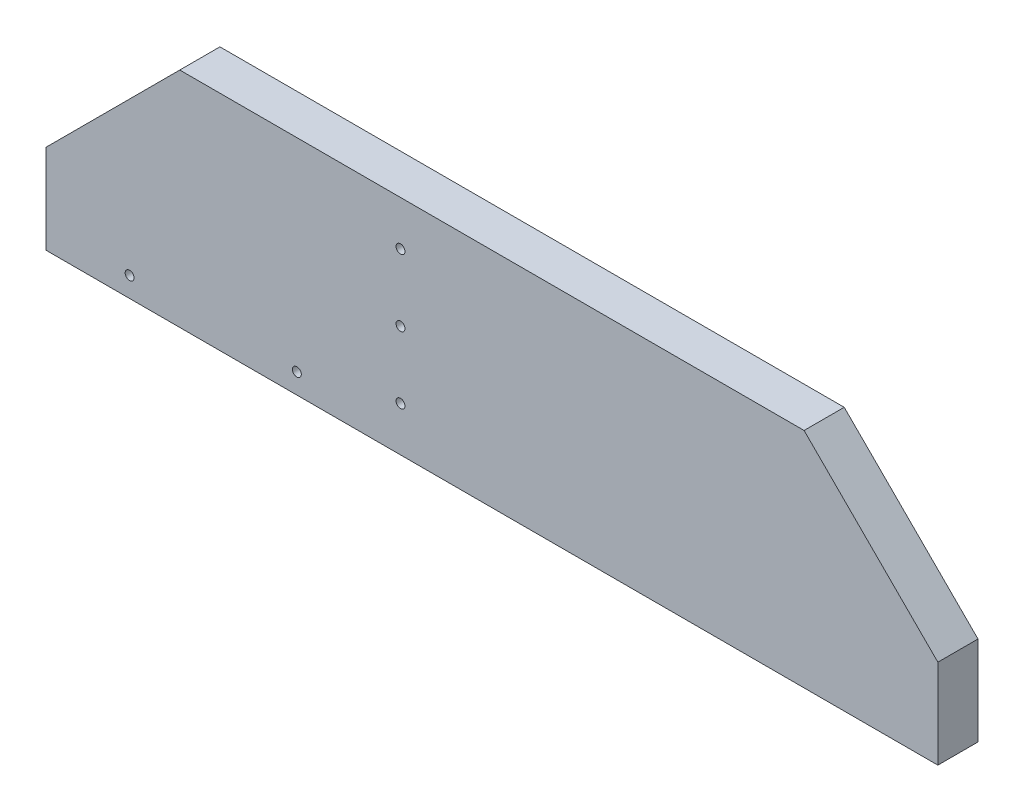
ISO-10303-21;
HEADER;
FILE_DESCRIPTION(('STEP AP214'),'2;1');
FILE_NAME('part.step','',(''),(''),'','','');
FILE_SCHEMA(('AUTOMOTIVE_DESIGN { 1 0 10303 214 1 1 1 1 }'));
ENDSEC;
DATA;
#1=APPLICATION_CONTEXT('core data for automotive mechanical design processes');
#2=APPLICATION_PROTOCOL_DEFINITION('international standard','automotive_design',2000,#1);
#3=PRODUCT_CONTEXT('',#1,'mechanical');
#4=PRODUCT('Part','Part','',(#3));
#5=PRODUCT_RELATED_PRODUCT_CATEGORY('part','',(#4));
#6=PRODUCT_DEFINITION_FORMATION('','',#4);
#7=PRODUCT_DEFINITION_CONTEXT('part definition',#1,'design');
#8=PRODUCT_DEFINITION('design','',#6,#7);
#9=PRODUCT_DEFINITION_SHAPE('','',#8);
#10=(LENGTH_UNIT() NAMED_UNIT(*) SI_UNIT(.MILLI.,.METRE.));
#11=(NAMED_UNIT(*) PLANE_ANGLE_UNIT() SI_UNIT($,.RADIAN.));
#12=(NAMED_UNIT(*) SI_UNIT($,.STERADIAN.) SOLID_ANGLE_UNIT());
#13=UNCERTAINTY_MEASURE_WITH_UNIT(LENGTH_MEASURE(1.E-05),#10,'distance_accuracy_value','');
#14=(GEOMETRIC_REPRESENTATION_CONTEXT(3) GLOBAL_UNCERTAINTY_ASSIGNED_CONTEXT((#13)) GLOBAL_UNIT_ASSIGNED_CONTEXT((#10,
#11,#12)) REPRESENTATION_CONTEXT('',''));
#15=CARTESIAN_POINT('',(0.,0.,0.));
#16=DIRECTION('',(0.,0.,1.));
#17=DIRECTION('',(1.,0.,0.));
#18=AXIS2_PLACEMENT_3D('',#15,#16,#17);
#19=CARTESIAN_POINT('',(-57.6200353355251,25.4898258977149,1.8));
#20=DIRECTION('',(1.,0.,0.));
#21=DIRECTION('',(0.,0.,-1.));
#22=AXIS2_PLACEMENT_3D('',#19,#20,#21);
#23=PLANE('',#22);
#24=DIRECTION('',(0.,-1.,0.));
#25=VECTOR('',#24,1.);
#26=CARTESIAN_POINT('',(-57.6200353355251,25.4898258977149,1.8));
#27=LINE('',#26,#25);
#28=CARTESIAN_POINT('',(-57.6200353355251,19.4898258977149,1.8));
#29=VERTEX_POINT('',#28);
#30=CARTESIAN_POINT('',(-57.6200353355251,15.4898258977149,1.8));
#31=VERTEX_POINT('',#30);
#32=EDGE_CURVE('E98',#29,#31,#27,.T.);
#33=ORIENTED_EDGE('',*,*,#32,.F.);
#34=DIRECTION('',(0.,0.,1.));
#35=VECTOR('',#34,1.);
#36=CARTESIAN_POINT('',(-57.6200353355251,19.4898258977149,0.));
#37=LINE('',#36,#35);
#38=CARTESIAN_POINT('',(-57.6200353355251,19.4898258977149,0.));
#39=VERTEX_POINT('',#38);
#40=EDGE_CURVE('E85',#39,#29,#37,.T.);
#41=ORIENTED_EDGE('',*,*,#40,.F.);
#42=DIRECTION('',(0.,-1.,0.));
#43=VECTOR('',#42,1.);
#44=CARTESIAN_POINT('',(-57.6200353355251,25.4898258977149,0.));
#45=LINE('',#44,#43);
#46=CARTESIAN_POINT('',(-57.6200353355251,15.4898258977149,0.));
#47=VERTEX_POINT('',#46);
#48=EDGE_CURVE('E96',#39,#47,#45,.T.);
#49=ORIENTED_EDGE('',*,*,#48,.T.);
#50=DIRECTION('',(0.,0.,-1.));
#51=VECTOR('',#50,1.);
#52=CARTESIAN_POINT('',(-57.6200353355251,15.4898258977149,1.8));
#53=LINE('',#52,#51);
#54=EDGE_CURVE('E11',#31,#47,#53,.T.);
#55=ORIENTED_EDGE('',*,*,#54,.F.);
#56=EDGE_LOOP('',(#33,#41,#49,#55));
#57=FACE_BOUND('',#56,.T.);
#58=ADVANCED_FACE('F33',(#57),#23,.F.);
#59=CARTESIAN_POINT('',(-57.6200353355251,15.4898258977149,1.8));
#60=DIRECTION('',(0.,1.,0.));
#61=DIRECTION('',(0.,0.,1.));
#62=AXIS2_PLACEMENT_3D('',#59,#60,#61);
#63=PLANE('',#62);
#64=DIRECTION('',(1.,0.,0.));
#65=VECTOR('',#64,1.);
#66=CARTESIAN_POINT('',(-57.6200353355251,15.4898258977149,0.));
#67=LINE('',#66,#65);
#68=CARTESIAN_POINT('',(-17.6200353355251,15.4898258977149,0.));
#69=VERTEX_POINT('',#68);
#70=EDGE_CURVE('E102',#47,#69,#67,.T.);
#71=ORIENTED_EDGE('',*,*,#70,.T.);
#72=DIRECTION('',(0.,0.,-1.));
#73=VECTOR('',#72,1.);
#74=CARTESIAN_POINT('',(-17.6200353355251,15.4898258977149,1.8));
#75=LINE('',#74,#73);
#76=CARTESIAN_POINT('',(-17.6200353355251,15.4898258977149,1.8));
#77=VERTEX_POINT('',#76);
#78=EDGE_CURVE('E40',#77,#69,#75,.T.);
#79=ORIENTED_EDGE('',*,*,#78,.F.);
#80=DIRECTION('',(1.,0.,0.));
#81=VECTOR('',#80,1.);
#82=CARTESIAN_POINT('',(-57.6200353355251,15.4898258977149,1.8));
#83=LINE('',#82,#81);
#84=EDGE_CURVE('E124',#31,#77,#83,.T.);
#85=ORIENTED_EDGE('',*,*,#84,.F.);
#86=ORIENTED_EDGE('',*,*,#54,.T.);
#87=EDGE_LOOP('',(#71,#79,#85,#86));
#88=FACE_BOUND('',#87,.T.);
#89=ADVANCED_FACE('F193',(#88),#63,.F.);
#90=CARTESIAN_POINT('',(-17.6200353355251,25.4898258977149,1.8));
#91=DIRECTION('',(-1.,0.,0.));
#92=DIRECTION('',(0.,0.,1.));
#93=AXIS2_PLACEMENT_3D('',#90,#91,#92);
#94=PLANE('',#93);
#95=DIRECTION('',(0.,1.,0.));
#96=VECTOR('',#95,1.);
#97=CARTESIAN_POINT('',(-17.6200353355251,25.4898258977149,0.));
#98=LINE('',#97,#96);
#99=CARTESIAN_POINT('',(-17.6200353355251,19.4898258977149,0.));
#100=VERTEX_POINT('',#99);
#101=EDGE_CURVE('E104',#69,#100,#98,.T.);
#102=ORIENTED_EDGE('',*,*,#101,.T.);
#103=DIRECTION('',(0.,0.,1.));
#104=VECTOR('',#103,1.);
#105=CARTESIAN_POINT('',(-17.6200353355251,19.4898258977149,0.));
#106=LINE('',#105,#104);
#107=CARTESIAN_POINT('',(-17.6200353355251,19.4898258977149,1.8));
#108=VERTEX_POINT('',#107);
#109=EDGE_CURVE('E47',#100,#108,#106,.T.);
#110=ORIENTED_EDGE('',*,*,#109,.T.);
#111=DIRECTION('',(0.,1.,0.));
#112=VECTOR('',#111,1.);
#113=CARTESIAN_POINT('',(-17.6200353355251,25.4898258977149,1.8));
#114=LINE('',#113,#112);
#115=EDGE_CURVE('E119',#77,#108,#114,.T.);
#116=ORIENTED_EDGE('',*,*,#115,.F.);
#117=ORIENTED_EDGE('',*,*,#78,.T.);
#118=EDGE_LOOP('',(#102,#110,#116,#117));
#119=FACE_BOUND('',#118,.T.);
#120=ADVANCED_FACE('F191',(#119),#94,.F.);
#121=CARTESIAN_POINT('',(-57.6200353355251,25.4898258977149,1.8));
#122=DIRECTION('',(0.,-1.,0.));
#123=DIRECTION('',(0.,0.,-1.));
#124=AXIS2_PLACEMENT_3D('',#121,#122,#123);
#125=PLANE('',#124);
#126=DIRECTION('',(-1.,0.,0.));
#127=VECTOR('',#126,1.);
#128=CARTESIAN_POINT('',(-57.6200353355251,25.4898258977149,0.));
#129=LINE('',#128,#127);
#130=CARTESIAN_POINT('',(-23.6200353355251,25.4898258977149,0.));
#131=VERTEX_POINT('',#130);
#132=CARTESIAN_POINT('',(-51.6200353355251,25.4898258977149,0.));
#133=VERTEX_POINT('',#132);
#134=EDGE_CURVE('E113',#131,#133,#129,.T.);
#135=ORIENTED_EDGE('',*,*,#134,.T.);
#136=DIRECTION('',(0.,0.,1.));
#137=VECTOR('',#136,1.);
#138=CARTESIAN_POINT('',(-51.6200353355251,25.4898258977149,0.));
#139=LINE('',#138,#137);
#140=CARTESIAN_POINT('',(-51.6200353355251,25.4898258977149,1.8));
#141=VERTEX_POINT('',#140);
#142=EDGE_CURVE('E55',#133,#141,#139,.T.);
#143=ORIENTED_EDGE('',*,*,#142,.T.);
#144=DIRECTION('',(-1.,0.,0.));
#145=VECTOR('',#144,1.);
#146=CARTESIAN_POINT('',(-57.6200353355251,25.4898258977149,1.8));
#147=LINE('',#146,#145);
#148=CARTESIAN_POINT('',(-23.6200353355251,25.4898258977149,1.8));
#149=VERTEX_POINT('',#148);
#150=EDGE_CURVE('E108',#149,#141,#147,.T.);
#151=ORIENTED_EDGE('',*,*,#150,.F.);
#152=DIRECTION('',(0.,0.,1.));
#153=VECTOR('',#152,1.);
#154=CARTESIAN_POINT('',(-23.6200353355251,25.4898258977149,0.));
#155=LINE('',#154,#153);
#156=EDGE_CURVE('E128',#131,#149,#155,.T.);
#157=ORIENTED_EDGE('',*,*,#156,.F.);
#158=EDGE_LOOP('',(#135,#143,#151,#157));
#159=FACE_BOUND('',#158,.T.);
#160=ADVANCED_FACE('F179',(#159),#125,.F.);
#161=CARTESIAN_POINT('',(0.,0.,1.8));
#162=DIRECTION('',(0.,0.,1.));
#163=DIRECTION('',(1.,0.,0.));
#164=AXIS2_PLACEMENT_3D('',#161,#162,#163);
#165=PLANE('',#164);
#166=CARTESIAN_POINT('',(-53.8700353355251,16.3898258977149,1.8));
#167=DIRECTION('',(0.,0.,1.));
#168=DIRECTION('',(1.,0.,0.));
#169=AXIS2_PLACEMENT_3D('',#166,#167,#168);
#170=CIRCLE('',#169,0.199999999999995);
#171=CARTESIAN_POINT('',(-53.6700353355251,16.3898258977149,1.8));
#172=VERTEX_POINT('',#171);
#173=EDGE_CURVE('E161',#172,#172,#170,.T.);
#174=ORIENTED_EDGE('',*,*,#173,.F.);
#175=EDGE_LOOP('',(#174));
#176=FACE_BOUND('',#175,.T.);
#177=CARTESIAN_POINT('',(-46.3700353355251,16.3898258977149,1.8));
#178=DIRECTION('',(0.,0.,1.));
#179=DIRECTION('',(1.,0.,0.));
#180=AXIS2_PLACEMENT_3D('',#177,#178,#179);
#181=CIRCLE('',#180,0.199999999999995);
#182=CARTESIAN_POINT('',(-46.1700353355251,16.3898258977149,1.8));
#183=VERTEX_POINT('',#182);
#184=EDGE_CURVE('E155',#183,#183,#181,.T.);
#185=ORIENTED_EDGE('',*,*,#184,.F.);
#186=EDGE_LOOP('',(#185));
#187=FACE_BOUND('',#186,.T.);
#188=CARTESIAN_POINT('',(-41.7200353355251,23.4898258977149,1.8));
#189=DIRECTION('',(0.,0.,1.));
#190=DIRECTION('',(1.,0.,0.));
#191=AXIS2_PLACEMENT_3D('',#188,#189,#190);
#192=CIRCLE('',#191,0.199999999999995);
#193=CARTESIAN_POINT('',(-41.5200353355251,23.4898258977149,1.8));
#194=VERTEX_POINT('',#193);
#195=EDGE_CURVE('E146',#194,#194,#192,.T.);
#196=ORIENTED_EDGE('',*,*,#195,.F.);
#197=EDGE_LOOP('',(#196));
#198=FACE_BOUND('',#197,.T.);
#199=CARTESIAN_POINT('',(-41.7200353355251,17.4898258977149,1.8));
#200=DIRECTION('',(0.,0.,1.));
#201=DIRECTION('',(1.,0.,0.));
#202=AXIS2_PLACEMENT_3D('',#199,#200,#201);
#203=CIRCLE('',#202,0.199999999999995);
#204=CARTESIAN_POINT('',(-41.5200353355251,17.4898258977149,1.8));
#205=VERTEX_POINT('',#204);
#206=EDGE_CURVE('E140',#205,#205,#203,.T.);
#207=ORIENTED_EDGE('',*,*,#206,.F.);
#208=EDGE_LOOP('',(#207));
#209=FACE_BOUND('',#208,.T.);
#210=CARTESIAN_POINT('',(-41.7200353355251,20.4898258977149,1.8));
#211=DIRECTION('',(0.,0.,1.));
#212=DIRECTION('',(1.,0.,0.));
#213=AXIS2_PLACEMENT_3D('',#210,#211,#212);
#214=CIRCLE('',#213,0.199999999999995);
#215=CARTESIAN_POINT('',(-41.5200353355251,20.4898258977149,1.8));
#216=VERTEX_POINT('',#215);
#217=EDGE_CURVE('E137',#216,#216,#214,.T.);
#218=ORIENTED_EDGE('',*,*,#217,.F.);
#219=EDGE_LOOP('',(#218));
#220=FACE_BOUND('',#219,.T.);
#221=DIRECTION('',(0.707106781186548,0.707106781186548,0.));
#222=VECTOR('',#221,1.);
#223=CARTESIAN_POINT('',(-51.6200353355251,25.4898258977149,1.8));
#224=LINE('',#223,#222);
#225=EDGE_CURVE('E91',#29,#141,#224,.T.);
#226=ORIENTED_EDGE('',*,*,#225,.F.);
#227=ORIENTED_EDGE('',*,*,#32,.T.);
#228=ORIENTED_EDGE('',*,*,#84,.T.);
#229=ORIENTED_EDGE('',*,*,#115,.T.);
#230=DIRECTION('',(0.707106781186548,-0.707106781186548,0.));
#231=VECTOR('',#230,1.);
#232=CARTESIAN_POINT('',(-17.6200353355251,19.4898258977149,1.8));
#233=LINE('',#232,#231);
#234=EDGE_CURVE('E132',#149,#108,#233,.T.);
#235=ORIENTED_EDGE('',*,*,#234,.F.);
#236=ORIENTED_EDGE('',*,*,#150,.T.);
#237=EDGE_LOOP('',(#226,#227,#228,#229,#235,#236));
#238=FACE_BOUND('',#237,.T.);
#239=ADVANCED_FACE('F176',(#176,#187,#198,#209,#220,#238),#165,.T.);
#240=CARTESIAN_POINT('',(0.,0.,0.));
#241=DIRECTION('',(0.,0.,1.));
#242=DIRECTION('',(1.,0.,0.));
#243=AXIS2_PLACEMENT_3D('',#240,#241,#242);
#244=PLANE('',#243);
#245=CARTESIAN_POINT('',(-53.8700353355251,16.3898258977149,0.));
#246=DIRECTION('',(0.,0.,1.));
#247=DIRECTION('',(1.,0.,0.));
#248=AXIS2_PLACEMENT_3D('',#245,#246,#247);
#249=CIRCLE('',#248,0.199999999999995);
#250=CARTESIAN_POINT('',(-53.6700353355251,16.3898258977149,0.));
#251=VERTEX_POINT('',#250);
#252=EDGE_CURVE('E147',#251,#251,#249,.T.);
#253=ORIENTED_EDGE('',*,*,#252,.T.);
#254=EDGE_LOOP('',(#253));
#255=FACE_BOUND('',#254,.T.);
#256=CARTESIAN_POINT('',(-46.3700353355251,16.3898258977149,0.));
#257=DIRECTION('',(0.,0.,1.));
#258=DIRECTION('',(1.,0.,0.));
#259=AXIS2_PLACEMENT_3D('',#256,#257,#258);
#260=CIRCLE('',#259,0.199999999999995);
#261=CARTESIAN_POINT('',(-46.1700353355251,16.3898258977149,0.));
#262=VERTEX_POINT('',#261);
#263=EDGE_CURVE('E158',#262,#262,#260,.T.);
#264=ORIENTED_EDGE('',*,*,#263,.T.);
#265=EDGE_LOOP('',(#264));
#266=FACE_BOUND('',#265,.T.);
#267=CARTESIAN_POINT('',(-41.7200353355251,23.4898258977149,0.));
#268=DIRECTION('',(0.,0.,1.));
#269=DIRECTION('',(1.,0.,0.));
#270=AXIS2_PLACEMENT_3D('',#267,#268,#269);
#271=CIRCLE('',#270,0.199999999999995);
#272=CARTESIAN_POINT('',(-41.5200353355251,23.4898258977149,0.));
#273=VERTEX_POINT('',#272);
#274=EDGE_CURVE('E143',#273,#273,#271,.T.);
#275=ORIENTED_EDGE('',*,*,#274,.T.);
#276=EDGE_LOOP('',(#275));
#277=FACE_BOUND('',#276,.T.);
#278=CARTESIAN_POINT('',(-41.7200353355251,17.4898258977149,0.));
#279=DIRECTION('',(0.,0.,1.));
#280=DIRECTION('',(1.,0.,0.));
#281=AXIS2_PLACEMENT_3D('',#278,#279,#280);
#282=CIRCLE('',#281,0.199999999999995);
#283=CARTESIAN_POINT('',(-41.5200353355251,17.4898258977149,0.));
#284=VERTEX_POINT('',#283);
#285=EDGE_CURVE('E150',#284,#284,#282,.T.);
#286=ORIENTED_EDGE('',*,*,#285,.T.);
#287=EDGE_LOOP('',(#286));
#288=FACE_BOUND('',#287,.T.);
#289=CARTESIAN_POINT('',(-41.7200353355251,20.4898258977149,0.));
#290=DIRECTION('',(0.,0.,1.));
#291=DIRECTION('',(1.,0.,0.));
#292=AXIS2_PLACEMENT_3D('',#289,#290,#291);
#293=CIRCLE('',#292,0.199999999999995);
#294=CARTESIAN_POINT('',(-41.5200353355251,20.4898258977149,0.));
#295=VERTEX_POINT('',#294);
#296=EDGE_CURVE('E134',#295,#295,#293,.T.);
#297=ORIENTED_EDGE('',*,*,#296,.T.);
#298=EDGE_LOOP('',(#297));
#299=FACE_BOUND('',#298,.T.);
#300=ORIENTED_EDGE('',*,*,#48,.F.);
#301=DIRECTION('',(0.707106781186548,0.707106781186548,0.));
#302=VECTOR('',#301,1.);
#303=CARTESIAN_POINT('',(-51.6200353355251,25.4898258977149,0.));
#304=LINE('',#303,#302);
#305=EDGE_CURVE('E82',#39,#133,#304,.T.);
#306=ORIENTED_EDGE('',*,*,#305,.T.);
#307=ORIENTED_EDGE('',*,*,#134,.F.);
#308=DIRECTION('',(0.707106781186548,-0.707106781186548,0.));
#309=VECTOR('',#308,1.);
#310=CARTESIAN_POINT('',(-17.6200353355251,19.4898258977149,0.));
#311=LINE('',#310,#309);
#312=EDGE_CURVE('E130',#131,#100,#311,.T.);
#313=ORIENTED_EDGE('',*,*,#312,.T.);
#314=ORIENTED_EDGE('',*,*,#101,.F.);
#315=ORIENTED_EDGE('',*,*,#70,.F.);
#316=EDGE_LOOP('',(#300,#306,#307,#313,#314,#315));
#317=FACE_BOUND('',#316,.T.);
#318=ADVANCED_FACE('F100',(#255,#266,#277,#288,#299,#317),#244,.F.);
#319=CARTESIAN_POINT('',(-17.6200353355251,19.4898258977149,0.));
#320=DIRECTION('',(-0.707106781186547,-0.707106781186547,0.));
#321=DIRECTION('',(0.707106781186548,-0.707106781186548,0.));
#322=AXIS2_PLACEMENT_3D('',#319,#320,#321);
#323=PLANE('',#322);
#324=ORIENTED_EDGE('',*,*,#234,.T.);
#325=ORIENTED_EDGE('',*,*,#109,.F.);
#326=ORIENTED_EDGE('',*,*,#312,.F.);
#327=ORIENTED_EDGE('',*,*,#156,.T.);
#328=EDGE_LOOP('',(#324,#325,#326,#327));
#329=FACE_BOUND('',#328,.T.);
#330=ADVANCED_FACE('F236',(#329),#323,.F.);
#331=CARTESIAN_POINT('',(-51.6200353355251,25.4898258977149,0.));
#332=DIRECTION('',(0.707106781186547,-0.707106781186547,0.));
#333=DIRECTION('',(0.707106781186548,0.707106781186548,0.));
#334=AXIS2_PLACEMENT_3D('',#331,#332,#333);
#335=PLANE('',#334);
#336=ORIENTED_EDGE('',*,*,#225,.T.);
#337=ORIENTED_EDGE('',*,*,#142,.F.);
#338=ORIENTED_EDGE('',*,*,#305,.F.);
#339=ORIENTED_EDGE('',*,*,#40,.T.);
#340=EDGE_LOOP('',(#336,#337,#338,#339));
#341=FACE_BOUND('',#340,.T.);
#342=ADVANCED_FACE('F84',(#341),#335,.F.);
#343=CARTESIAN_POINT('',(-41.7200353355251,20.4898258977149,0.));
#344=DIRECTION('',(0.,0.,1.));
#345=DIRECTION('',(1.,0.,0.));
#346=AXIS2_PLACEMENT_3D('',#343,#344,#345);
#347=CYLINDRICAL_SURFACE('',#346,0.199999999999995);
#348=ORIENTED_EDGE('',*,*,#296,.F.);
#349=EDGE_LOOP('',(#348));
#350=FACE_BOUND('',#349,.T.);
#351=ORIENTED_EDGE('',*,*,#217,.T.);
#352=EDGE_LOOP('',(#351));
#353=FACE_BOUND('',#352,.T.);
#354=ADVANCED_FACE('F251',(#350,#353),#347,.F.);
#355=CARTESIAN_POINT('',(-41.7200353355251,17.4898258977149,0.));
#356=DIRECTION('',(0.,0.,1.));
#357=DIRECTION('',(1.,0.,0.));
#358=AXIS2_PLACEMENT_3D('',#355,#356,#357);
#359=CYLINDRICAL_SURFACE('',#358,0.199999999999995);
#360=ORIENTED_EDGE('',*,*,#285,.F.);
#361=EDGE_LOOP('',(#360));
#362=FACE_BOUND('',#361,.T.);
#363=ORIENTED_EDGE('',*,*,#206,.T.);
#364=EDGE_LOOP('',(#363));
#365=FACE_BOUND('',#364,.T.);
#366=ADVANCED_FACE('F259',(#362,#365),#359,.F.);
#367=CARTESIAN_POINT('',(-41.7200353355251,23.4898258977149,0.));
#368=DIRECTION('',(0.,0.,1.));
#369=DIRECTION('',(1.,0.,0.));
#370=AXIS2_PLACEMENT_3D('',#367,#368,#369);
#371=CYLINDRICAL_SURFACE('',#370,0.199999999999995);
#372=ORIENTED_EDGE('',*,*,#274,.F.);
#373=EDGE_LOOP('',(#372));
#374=FACE_BOUND('',#373,.T.);
#375=ORIENTED_EDGE('',*,*,#195,.T.);
#376=EDGE_LOOP('',(#375));
#377=FACE_BOUND('',#376,.T.);
#378=ADVANCED_FACE('F268',(#374,#377),#371,.F.);
#379=CARTESIAN_POINT('',(-46.3700353355251,16.3898258977149,0.));
#380=DIRECTION('',(0.,0.,1.));
#381=DIRECTION('',(1.,0.,0.));
#382=AXIS2_PLACEMENT_3D('',#379,#380,#381);
#383=CYLINDRICAL_SURFACE('',#382,0.199999999999995);
#384=ORIENTED_EDGE('',*,*,#263,.F.);
#385=EDGE_LOOP('',(#384));
#386=FACE_BOUND('',#385,.T.);
#387=ORIENTED_EDGE('',*,*,#184,.T.);
#388=EDGE_LOOP('',(#387));
#389=FACE_BOUND('',#388,.T.);
#390=ADVANCED_FACE('F172',(#386,#389),#383,.F.);
#391=CARTESIAN_POINT('',(-53.8700353355251,16.3898258977149,0.));
#392=DIRECTION('',(0.,0.,1.));
#393=DIRECTION('',(1.,0.,0.));
#394=AXIS2_PLACEMENT_3D('',#391,#392,#393);
#395=CYLINDRICAL_SURFACE('',#394,0.199999999999995);
#396=ORIENTED_EDGE('',*,*,#252,.F.);
#397=EDGE_LOOP('',(#396));
#398=FACE_BOUND('',#397,.T.);
#399=ORIENTED_EDGE('',*,*,#173,.T.);
#400=EDGE_LOOP('',(#399));
#401=FACE_BOUND('',#400,.T.);
#402=ADVANCED_FACE('F169',(#398,#401),#395,.F.);
#403=CLOSED_SHELL('',(#58,#89,#120,#160,#239,#318,#330,#342,#354,#366,#378,#390,#402));
#404=MANIFOLD_SOLID_BREP('B2',#403);
#405=ADVANCED_BREP_SHAPE_REPRESENTATION('',(#18,#404),#14);
#406=SHAPE_DEFINITION_REPRESENTATION(#9,#405);
ENDSEC;
END-ISO-10303-21;
